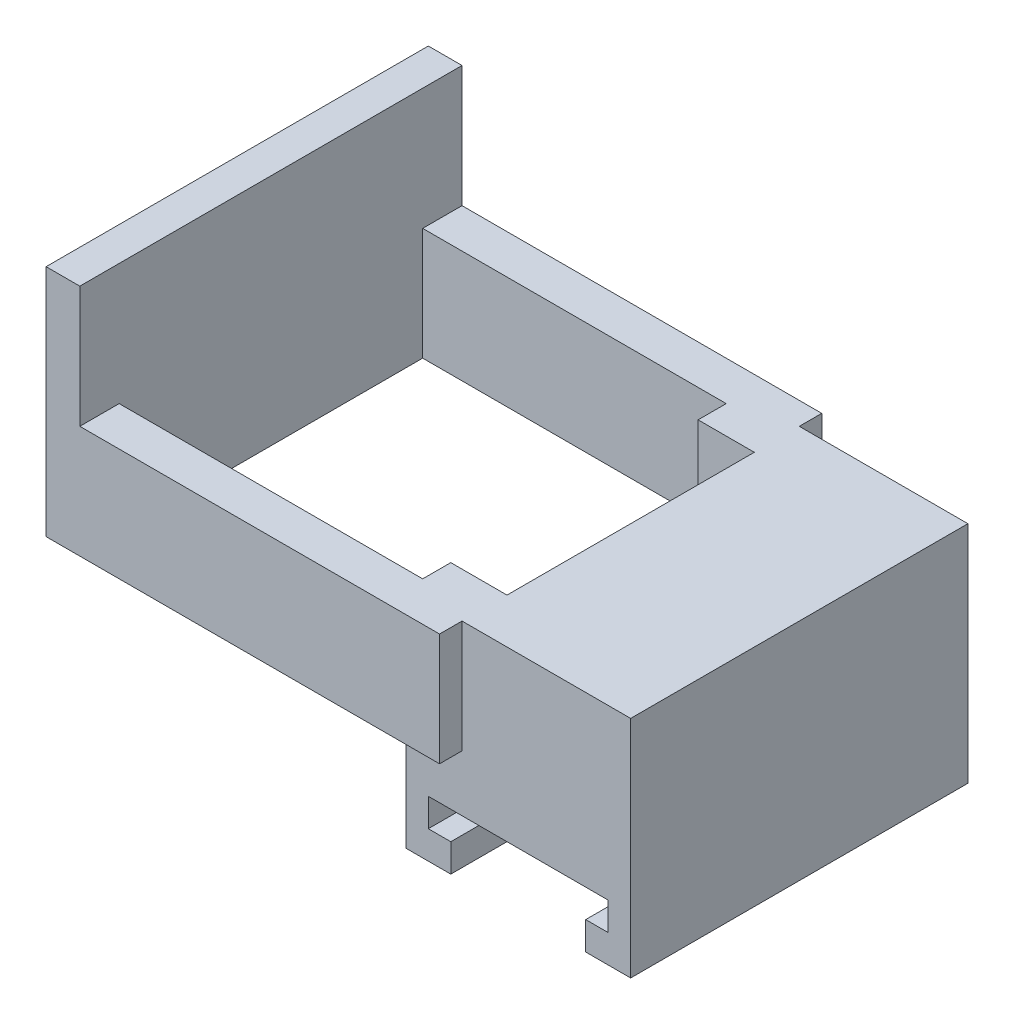
ISO-10303-21;
HEADER;
FILE_DESCRIPTION(('STEP AP214'),'2;1');
FILE_NAME('part.step','',(''),(''),'','','');
FILE_SCHEMA(('AUTOMOTIVE_DESIGN { 1 0 10303 214 1 1 1 1 }'));
ENDSEC;
DATA;
#1=APPLICATION_CONTEXT('core data for automotive mechanical design processes');
#2=APPLICATION_PROTOCOL_DEFINITION('international standard','automotive_design',2000,#1);
#3=PRODUCT_CONTEXT('',#1,'mechanical');
#4=PRODUCT('Part','Part','',(#3));
#5=PRODUCT_RELATED_PRODUCT_CATEGORY('part','',(#4));
#6=PRODUCT_DEFINITION_FORMATION('','',#4);
#7=PRODUCT_DEFINITION_CONTEXT('part definition',#1,'design');
#8=PRODUCT_DEFINITION('design','',#6,#7);
#9=PRODUCT_DEFINITION_SHAPE('','',#8);
#10=(LENGTH_UNIT() NAMED_UNIT(*) SI_UNIT(.MILLI.,.METRE.));
#11=(NAMED_UNIT(*) PLANE_ANGLE_UNIT() SI_UNIT($,.RADIAN.));
#12=(NAMED_UNIT(*) SI_UNIT($,.STERADIAN.) SOLID_ANGLE_UNIT());
#13=UNCERTAINTY_MEASURE_WITH_UNIT(LENGTH_MEASURE(1.E-05),#10,'distance_accuracy_value','');
#14=(GEOMETRIC_REPRESENTATION_CONTEXT(3) GLOBAL_UNCERTAINTY_ASSIGNED_CONTEXT((#13)) GLOBAL_UNIT_ASSIGNED_CONTEXT((#10,
#11,#12)) REPRESENTATION_CONTEXT('',''));
#15=CARTESIAN_POINT('',(0.,0.,0.));
#16=DIRECTION('',(0.,0.,1.));
#17=DIRECTION('',(1.,0.,0.));
#18=AXIS2_PLACEMENT_3D('',#15,#16,#17);
#19=CARTESIAN_POINT('',(0.,0.,0.));
#20=DIRECTION('',(0.,0.,-1.));
#21=DIRECTION('',(-1.,0.,0.));
#22=AXIS2_PLACEMENT_3D('',#19,#20,#21);
#23=PLANE('',#22);
#24=DIRECTION('',(0.,-1.,0.));
#25=VECTOR('',#24,1.);
#26=CARTESIAN_POINT('',(-19.7321469764376,-1.59822046465645,0.));
#27=LINE('',#26,#25);
#28=CARTESIAN_POINT('',(-19.7321469764376,18.4017795353435,0.));
#29=VERTEX_POINT('',#28);
#30=CARTESIAN_POINT('',(-19.7321469764376,-1.59822046465645,0.));
#31=VERTEX_POINT('',#30);
#32=EDGE_CURVE('E341',#29,#31,#27,.T.);
#33=ORIENTED_EDGE('',*,*,#32,.F.);
#34=DIRECTION('',(-1.,0.,0.));
#35=VECTOR('',#34,1.);
#36=CARTESIAN_POINT('',(-9.73214697643766,18.4017795353436,0.));
#37=LINE('',#36,#35);
#38=CARTESIAN_POINT('',(-9.73214697643766,18.4017795353436,0.));
#39=VERTEX_POINT('',#38);
#40=EDGE_CURVE('E285',#39,#29,#37,.T.);
#41=ORIENTED_EDGE('',*,*,#40,.F.);
#42=DIRECTION('',(0.,-1.,0.));
#43=VECTOR('',#42,1.);
#44=CARTESIAN_POINT('',(-9.73214697643766,38.4017795353436,0.));
#45=LINE('',#44,#43);
#46=CARTESIAN_POINT('',(-9.73214697643766,38.4017795353436,0.));
#47=VERTEX_POINT('',#46);
#48=EDGE_CURVE('E274',#47,#39,#45,.T.);
#49=ORIENTED_EDGE('',*,*,#48,.F.);
#50=DIRECTION('',(-1.,0.,0.));
#51=VECTOR('',#50,1.);
#52=CARTESIAN_POINT('',(-19.7321469764376,38.4017795353436,0.));
#53=LINE('',#52,#51);
#54=CARTESIAN_POINT('',(20.2678530235624,38.4017795353436,0.));
#55=VERTEX_POINT('',#54);
#56=EDGE_CURVE('E345',#55,#47,#53,.T.);
#57=ORIENTED_EDGE('',*,*,#56,.F.);
#58=DIRECTION('',(0.,1.,0.));
#59=VECTOR('',#58,1.);
#60=CARTESIAN_POINT('',(20.2678530235624,38.4017795353436,0.));
#61=LINE('',#60,#59);
#62=CARTESIAN_POINT('',(20.2678530235624,-1.59822046465645,0.));
#63=VERTEX_POINT('',#62);
#64=EDGE_CURVE('E387',#63,#55,#61,.T.);
#65=ORIENTED_EDGE('',*,*,#64,.F.);
#66=DIRECTION('',(1.,0.,0.));
#67=VECTOR('',#66,1.);
#68=CARTESIAN_POINT('',(20.2678530235624,-1.59822046465645,0.));
#69=LINE('',#68,#67);
#70=CARTESIAN_POINT('',(12.2678530235624,-1.59822046465645,0.));
#71=VERTEX_POINT('',#70);
#72=EDGE_CURVE('E385',#71,#63,#69,.T.);
#73=ORIENTED_EDGE('',*,*,#72,.F.);
#74=DIRECTION('',(0.,-1.,0.));
#75=VECTOR('',#74,1.);
#76=CARTESIAN_POINT('',(12.2678530235624,-1.59822046465645,0.));
#77=LINE('',#76,#75);
#78=CARTESIAN_POINT('',(12.2678530235624,3.40177953534355,0.));
#79=VERTEX_POINT('',#78);
#80=EDGE_CURVE('E383',#79,#71,#77,.T.);
#81=ORIENTED_EDGE('',*,*,#80,.F.);
#82=DIRECTION('',(-1.,0.,0.));
#83=VECTOR('',#82,1.);
#84=CARTESIAN_POINT('',(12.2678530235624,3.40177953534355,0.));
#85=LINE('',#84,#83);
#86=CARTESIAN_POINT('',(16.2678530235624,3.40177953534355,0.));
#87=VERTEX_POINT('',#86);
#88=EDGE_CURVE('E381',#87,#79,#85,.T.);
#89=ORIENTED_EDGE('',*,*,#88,.F.);
#90=DIRECTION('',(0.,-1.,0.));
#91=VECTOR('',#90,1.);
#92=CARTESIAN_POINT('',(16.2678530235624,3.40177953534355,0.));
#93=LINE('',#92,#91);
#94=CARTESIAN_POINT('',(16.2678530235624,8.40177953534355,0.));
#95=VERTEX_POINT('',#94);
#96=EDGE_CURVE('E379',#95,#87,#93,.T.);
#97=ORIENTED_EDGE('',*,*,#96,.F.);
#98=DIRECTION('',(1.,0.,0.));
#99=VECTOR('',#98,1.);
#100=CARTESIAN_POINT('',(-15.7321469764376,8.40177953534355,0.));
#101=LINE('',#100,#99);
#102=CARTESIAN_POINT('',(-15.7321469764376,8.40177953534355,0.));
#103=VERTEX_POINT('',#102);
#104=EDGE_CURVE('E377',#103,#95,#101,.T.);
#105=ORIENTED_EDGE('',*,*,#104,.F.);
#106=DIRECTION('',(0.,1.,0.));
#107=VECTOR('',#106,1.);
#108=CARTESIAN_POINT('',(-15.7321469764376,3.40177953534355,0.));
#109=LINE('',#108,#107);
#110=CARTESIAN_POINT('',(-15.7321469764376,3.40177953534355,0.));
#111=VERTEX_POINT('',#110);
#112=EDGE_CURVE('E375',#111,#103,#109,.T.);
#113=ORIENTED_EDGE('',*,*,#112,.F.);
#114=DIRECTION('',(-1.,0.,0.));
#115=VECTOR('',#114,1.);
#116=CARTESIAN_POINT('',(-11.7321469764376,3.40177953534355,0.));
#117=LINE('',#116,#115);
#118=CARTESIAN_POINT('',(-11.7321469764376,3.40177953534355,0.));
#119=VERTEX_POINT('',#118);
#120=EDGE_CURVE('E373',#119,#111,#117,.T.);
#121=ORIENTED_EDGE('',*,*,#120,.F.);
#122=DIRECTION('',(0.,1.,0.));
#123=VECTOR('',#122,1.);
#124=CARTESIAN_POINT('',(-11.7321469764376,-1.59822046465645,0.));
#125=LINE('',#124,#123);
#126=CARTESIAN_POINT('',(-11.7321469764376,-1.59822046465645,0.));
#127=VERTEX_POINT('',#126);
#128=EDGE_CURVE('E371',#127,#119,#125,.T.);
#129=ORIENTED_EDGE('',*,*,#128,.F.);
#130=DIRECTION('',(1.,0.,0.));
#131=VECTOR('',#130,1.);
#132=CARTESIAN_POINT('',(-19.7321469764376,-1.59822046465645,0.));
#133=LINE('',#132,#131);
#134=EDGE_CURVE('E369',#31,#127,#133,.T.);
#135=ORIENTED_EDGE('',*,*,#134,.F.);
#136=EDGE_LOOP('',(#33,#41,#49,#57,#65,#73,#81,#89,#97,#105,#113,#121,#129,#135));
#137=FACE_BOUND('',#136,.T.);
#138=ADVANCED_FACE('F35',(#137),#23,.T.);
#139=CARTESIAN_POINT('',(0.,0.,60.));
#140=DIRECTION('',(0.,0.,-1.));
#141=DIRECTION('',(-1.,0.,0.));
#142=AXIS2_PLACEMENT_3D('',#139,#140,#141);
#143=PLANE('',#142);
#144=DIRECTION('',(-1.,0.,0.));
#145=VECTOR('',#144,1.);
#146=CARTESIAN_POINT('',(-9.73214697643766,18.4017795353435,60.));
#147=LINE('',#146,#145);
#148=CARTESIAN_POINT('',(-9.73214697643766,18.4017795353435,60.));
#149=VERTEX_POINT('',#148);
#150=CARTESIAN_POINT('',(-19.7321469764376,18.4017795353435,60.));
#151=VERTEX_POINT('',#150);
#152=EDGE_CURVE('E297',#149,#151,#147,.T.);
#153=ORIENTED_EDGE('',*,*,#152,.T.);
#154=DIRECTION('',(0.,-1.,0.));
#155=VECTOR('',#154,1.);
#156=CARTESIAN_POINT('',(-19.7321469764376,-1.59822046465645,60.));
#157=LINE('',#156,#155);
#158=CARTESIAN_POINT('',(-19.7321469764376,-1.59822046465645,60.));
#159=VERTEX_POINT('',#158);
#160=EDGE_CURVE('E342',#151,#159,#157,.T.);
#161=ORIENTED_EDGE('',*,*,#160,.T.);
#162=DIRECTION('',(1.,0.,0.));
#163=VECTOR('',#162,1.);
#164=CARTESIAN_POINT('',(-19.7321469764376,-1.59822046465645,60.));
#165=LINE('',#164,#163);
#166=CARTESIAN_POINT('',(-11.7321469764376,-1.59822046465645,60.));
#167=VERTEX_POINT('',#166);
#168=EDGE_CURVE('E344',#159,#167,#165,.T.);
#169=ORIENTED_EDGE('',*,*,#168,.T.);
#170=DIRECTION('',(0.,1.,0.));
#171=VECTOR('',#170,1.);
#172=CARTESIAN_POINT('',(-11.7321469764376,-1.59822046465645,60.));
#173=LINE('',#172,#171);
#174=CARTESIAN_POINT('',(-11.7321469764376,3.40177953534355,60.));
#175=VERTEX_POINT('',#174);
#176=EDGE_CURVE('E347',#167,#175,#173,.T.);
#177=ORIENTED_EDGE('',*,*,#176,.T.);
#178=DIRECTION('',(-1.,0.,0.));
#179=VECTOR('',#178,1.);
#180=CARTESIAN_POINT('',(-11.7321469764376,3.40177953534355,60.));
#181=LINE('',#180,#179);
#182=CARTESIAN_POINT('',(-15.7321469764376,3.40177953534355,60.));
#183=VERTEX_POINT('',#182);
#184=EDGE_CURVE('E349',#175,#183,#181,.T.);
#185=ORIENTED_EDGE('',*,*,#184,.T.);
#186=DIRECTION('',(0.,1.,0.));
#187=VECTOR('',#186,1.);
#188=CARTESIAN_POINT('',(-15.7321469764376,3.40177953534355,60.));
#189=LINE('',#188,#187);
#190=CARTESIAN_POINT('',(-15.7321469764376,8.40177953534355,60.));
#191=VERTEX_POINT('',#190);
#192=EDGE_CURVE('E351',#183,#191,#189,.T.);
#193=ORIENTED_EDGE('',*,*,#192,.T.);
#194=DIRECTION('',(1.,0.,0.));
#195=VECTOR('',#194,1.);
#196=CARTESIAN_POINT('',(-15.7321469764376,8.40177953534355,60.));
#197=LINE('',#196,#195);
#198=CARTESIAN_POINT('',(16.2678530235624,8.40177953534355,60.));
#199=VERTEX_POINT('',#198);
#200=EDGE_CURVE('E353',#191,#199,#197,.T.);
#201=ORIENTED_EDGE('',*,*,#200,.T.);
#202=DIRECTION('',(0.,-1.,0.));
#203=VECTOR('',#202,1.);
#204=CARTESIAN_POINT('',(16.2678530235624,3.40177953534355,60.));
#205=LINE('',#204,#203);
#206=CARTESIAN_POINT('',(16.2678530235624,3.40177953534355,60.));
#207=VERTEX_POINT('',#206);
#208=EDGE_CURVE('E355',#199,#207,#205,.T.);
#209=ORIENTED_EDGE('',*,*,#208,.T.);
#210=DIRECTION('',(-1.,0.,0.));
#211=VECTOR('',#210,1.);
#212=CARTESIAN_POINT('',(12.2678530235624,3.40177953534355,60.));
#213=LINE('',#212,#211);
#214=CARTESIAN_POINT('',(12.2678530235624,3.40177953534355,60.));
#215=VERTEX_POINT('',#214);
#216=EDGE_CURVE('E357',#207,#215,#213,.T.);
#217=ORIENTED_EDGE('',*,*,#216,.T.);
#218=DIRECTION('',(0.,-1.,0.));
#219=VECTOR('',#218,1.);
#220=CARTESIAN_POINT('',(12.2678530235624,-1.59822046465645,60.));
#221=LINE('',#220,#219);
#222=CARTESIAN_POINT('',(12.2678530235624,-1.59822046465645,60.));
#223=VERTEX_POINT('',#222);
#224=EDGE_CURVE('E359',#215,#223,#221,.T.);
#225=ORIENTED_EDGE('',*,*,#224,.T.);
#226=DIRECTION('',(1.,0.,0.));
#227=VECTOR('',#226,1.);
#228=CARTESIAN_POINT('',(20.2678530235624,-1.59822046465645,60.));
#229=LINE('',#228,#227);
#230=CARTESIAN_POINT('',(20.2678530235624,-1.59822046465645,60.));
#231=VERTEX_POINT('',#230);
#232=EDGE_CURVE('E361',#223,#231,#229,.T.);
#233=ORIENTED_EDGE('',*,*,#232,.T.);
#234=DIRECTION('',(0.,1.,0.));
#235=VECTOR('',#234,1.);
#236=CARTESIAN_POINT('',(20.2678530235624,38.4017795353436,60.));
#237=LINE('',#236,#235);
#238=CARTESIAN_POINT('',(20.2678530235624,38.4017795353436,60.));
#239=VERTEX_POINT('',#238);
#240=EDGE_CURVE('E363',#231,#239,#237,.T.);
#241=ORIENTED_EDGE('',*,*,#240,.T.);
#242=DIRECTION('',(-1.,0.,0.));
#243=VECTOR('',#242,1.);
#244=CARTESIAN_POINT('',(-19.7321469764376,38.4017795353436,60.));
#245=LINE('',#244,#243);
#246=CARTESIAN_POINT('',(-9.73214697643766,38.4017795353436,60.));
#247=VERTEX_POINT('',#246);
#248=EDGE_CURVE('E365',#239,#247,#245,.T.);
#249=ORIENTED_EDGE('',*,*,#248,.T.);
#250=DIRECTION('',(0.,1.,0.));
#251=VECTOR('',#250,1.);
#252=CARTESIAN_POINT('',(-9.73214697643766,38.4017795353436,60.));
#253=LINE('',#252,#251);
#254=EDGE_CURVE('E292',#149,#247,#253,.T.);
#255=ORIENTED_EDGE('',*,*,#254,.F.);
#256=EDGE_LOOP('',(#153,#161,#169,#177,#185,#193,#201,#209,#217,#225,#233,#241,#249,#255));
#257=FACE_BOUND('',#256,.T.);
#258=ADVANCED_FACE('F461',(#257),#143,.F.);
#259=CARTESIAN_POINT('',(-19.7321469764376,-1.59822046465645,60.));
#260=DIRECTION('',(1.,0.,0.));
#261=DIRECTION('',(0.,0.,-1.));
#262=AXIS2_PLACEMENT_3D('',#259,#260,#261);
#263=PLANE('',#262);
#264=DIRECTION('',(0.,0.,1.));
#265=VECTOR('',#264,1.);
#266=CARTESIAN_POINT('',(-19.7321469764376,13.4017795353436,8.));
#267=LINE('',#266,#265);
#268=CARTESIAN_POINT('',(-19.7321469764376,13.4017795353436,8.));
#269=VERTEX_POINT('',#268);
#270=CARTESIAN_POINT('',(-19.7321469764376,13.4017795353436,52.));
#271=VERTEX_POINT('',#270);
#272=EDGE_CURVE('E244',#269,#271,#267,.T.);
#273=ORIENTED_EDGE('',*,*,#272,.F.);
#274=DIRECTION('',(0.,-1.,0.));
#275=VECTOR('',#274,1.);
#276=CARTESIAN_POINT('',(-19.7321469764376,13.4017795353436,8.));
#277=LINE('',#276,#275);
#278=CARTESIAN_POINT('',(-19.7321469764376,38.4017795353436,8.));
#279=VERTEX_POINT('',#278);
#280=EDGE_CURVE('E233',#279,#269,#277,.T.);
#281=ORIENTED_EDGE('',*,*,#280,.F.);
#282=DIRECTION('',(0.,0.,-1.));
#283=VECTOR('',#282,1.);
#284=CARTESIAN_POINT('',(-19.7321469764376,38.4017795353436,60.));
#285=LINE('',#284,#283);
#286=CARTESIAN_POINT('',(-19.7321469764376,38.4017795353436,3.));
#287=VERTEX_POINT('',#286);
#288=EDGE_CURVE('E58',#279,#287,#285,.T.);
#289=ORIENTED_EDGE('',*,*,#288,.T.);
#290=DIRECTION('',(0.,1.,0.));
#291=VECTOR('',#290,1.);
#292=CARTESIAN_POINT('',(-19.7321469764376,38.4017795353436,3.));
#293=LINE('',#292,#291);
#294=CARTESIAN_POINT('',(-19.7321469764376,18.4017795353436,3.));
#295=VERTEX_POINT('',#294);
#296=EDGE_CURVE('E319',#295,#287,#293,.T.);
#297=ORIENTED_EDGE('',*,*,#296,.F.);
#298=DIRECTION('',(0.,0.,1.));
#299=VECTOR('',#298,1.);
#300=CARTESIAN_POINT('',(-19.7321469764376,18.4017795353436,-4.));
#301=LINE('',#300,#299);
#302=EDGE_CURVE('E327',#29,#295,#301,.T.);
#303=ORIENTED_EDGE('',*,*,#302,.F.);
#304=ORIENTED_EDGE('',*,*,#32,.T.);
#305=DIRECTION('',(0.,0.,-1.));
#306=VECTOR('',#305,1.);
#307=CARTESIAN_POINT('',(-19.7321469764376,-1.59822046465645,60.));
#308=LINE('',#307,#306);
#309=EDGE_CURVE('E330',#159,#31,#308,.T.);
#310=ORIENTED_EDGE('',*,*,#309,.F.);
#311=ORIENTED_EDGE('',*,*,#160,.F.);
#312=DIRECTION('',(0.,0.,1.));
#313=VECTOR('',#312,1.);
#314=CARTESIAN_POINT('',(-19.7321469764376,18.4017795353436,64.));
#315=LINE('',#314,#313);
#316=CARTESIAN_POINT('',(-19.7321469764376,18.4017795353435,57.));
#317=VERTEX_POINT('',#316);
#318=EDGE_CURVE('E304',#317,#151,#315,.T.);
#319=ORIENTED_EDGE('',*,*,#318,.F.);
#320=DIRECTION('',(0.,-1.,0.));
#321=VECTOR('',#320,1.);
#322=CARTESIAN_POINT('',(-19.7321469764376,38.4017795353436,57.));
#323=LINE('',#322,#321);
#324=CARTESIAN_POINT('',(-19.7321469764376,38.4017795353436,57.));
#325=VERTEX_POINT('',#324);
#326=EDGE_CURVE('E299',#325,#317,#323,.T.);
#327=ORIENTED_EDGE('',*,*,#326,.F.);
#328=CARTESIAN_POINT('',(-19.7321469764376,38.4017795353436,52.));
#329=VERTEX_POINT('',#328);
#330=EDGE_CURVE('E391',#325,#329,#285,.T.);
#331=ORIENTED_EDGE('',*,*,#330,.T.);
#332=DIRECTION('',(0.,1.,0.));
#333=VECTOR('',#332,1.);
#334=CARTESIAN_POINT('',(-19.7321469764376,13.4017795353436,52.));
#335=LINE('',#334,#333);
#336=EDGE_CURVE('E228',#271,#329,#335,.T.);
#337=ORIENTED_EDGE('',*,*,#336,.F.);
#338=EDGE_LOOP('',(#273,#281,#289,#297,#303,#304,#310,#311,#319,#327,#331,#337));
#339=FACE_BOUND('',#338,.T.);
#340=ADVANCED_FACE('F37',(#339),#263,.F.);
#341=CARTESIAN_POINT('',(-19.7321469764376,-1.59822046465645,60.));
#342=DIRECTION('',(0.,1.,0.));
#343=DIRECTION('',(0.,0.,1.));
#344=AXIS2_PLACEMENT_3D('',#341,#342,#343);
#345=PLANE('',#344);
#346=ORIENTED_EDGE('',*,*,#134,.T.);
#347=DIRECTION('',(0.,0.,-1.));
#348=VECTOR('',#347,1.);
#349=CARTESIAN_POINT('',(-11.7321469764376,-1.59822046465645,60.));
#350=LINE('',#349,#348);
#351=EDGE_CURVE('E421',#167,#127,#350,.T.);
#352=ORIENTED_EDGE('',*,*,#351,.F.);
#353=ORIENTED_EDGE('',*,*,#168,.F.);
#354=ORIENTED_EDGE('',*,*,#309,.T.);
#355=EDGE_LOOP('',(#346,#352,#353,#354));
#356=FACE_BOUND('',#355,.T.);
#357=ADVANCED_FACE('F495',(#356),#345,.F.);
#358=CARTESIAN_POINT('',(-11.7321469764376,-1.59822046465645,60.));
#359=DIRECTION('',(-1.,0.,0.));
#360=DIRECTION('',(0.,0.,1.));
#361=AXIS2_PLACEMENT_3D('',#358,#359,#360);
#362=PLANE('',#361);
#363=ORIENTED_EDGE('',*,*,#128,.T.);
#364=DIRECTION('',(0.,0.,-1.));
#365=VECTOR('',#364,1.);
#366=CARTESIAN_POINT('',(-11.7321469764376,3.40177953534355,60.));
#367=LINE('',#366,#365);
#368=EDGE_CURVE('E418',#175,#119,#367,.T.);
#369=ORIENTED_EDGE('',*,*,#368,.F.);
#370=ORIENTED_EDGE('',*,*,#176,.F.);
#371=ORIENTED_EDGE('',*,*,#351,.T.);
#372=EDGE_LOOP('',(#363,#369,#370,#371));
#373=FACE_BOUND('',#372,.T.);
#374=ADVANCED_FACE('F499',(#373),#362,.F.);
#375=CARTESIAN_POINT('',(-11.7321469764376,3.40177953534355,60.));
#376=DIRECTION('',(0.,-1.,0.));
#377=DIRECTION('',(0.,0.,-1.));
#378=AXIS2_PLACEMENT_3D('',#375,#376,#377);
#379=PLANE('',#378);
#380=ORIENTED_EDGE('',*,*,#120,.T.);
#381=DIRECTION('',(0.,0.,-1.));
#382=VECTOR('',#381,1.);
#383=CARTESIAN_POINT('',(-15.7321469764376,3.40177953534355,60.));
#384=LINE('',#383,#382);
#385=EDGE_CURVE('E415',#183,#111,#384,.T.);
#386=ORIENTED_EDGE('',*,*,#385,.F.);
#387=ORIENTED_EDGE('',*,*,#184,.F.);
#388=ORIENTED_EDGE('',*,*,#368,.T.);
#389=EDGE_LOOP('',(#380,#386,#387,#388));
#390=FACE_BOUND('',#389,.T.);
#391=ADVANCED_FACE('F503',(#390),#379,.F.);
#392=CARTESIAN_POINT('',(-15.7321469764376,3.40177953534355,60.));
#393=DIRECTION('',(-1.,0.,0.));
#394=DIRECTION('',(0.,0.,1.));
#395=AXIS2_PLACEMENT_3D('',#392,#393,#394);
#396=PLANE('',#395);
#397=ORIENTED_EDGE('',*,*,#112,.T.);
#398=DIRECTION('',(0.,0.,-1.));
#399=VECTOR('',#398,1.);
#400=CARTESIAN_POINT('',(-15.7321469764376,8.40177953534355,60.));
#401=LINE('',#400,#399);
#402=EDGE_CURVE('E412',#191,#103,#401,.T.);
#403=ORIENTED_EDGE('',*,*,#402,.F.);
#404=ORIENTED_EDGE('',*,*,#192,.F.);
#405=ORIENTED_EDGE('',*,*,#385,.T.);
#406=EDGE_LOOP('',(#397,#403,#404,#405));
#407=FACE_BOUND('',#406,.T.);
#408=ADVANCED_FACE('F509',(#407),#396,.F.);
#409=CARTESIAN_POINT('',(-15.7321469764376,8.40177953534355,60.));
#410=DIRECTION('',(0.,1.,0.));
#411=DIRECTION('',(0.,0.,1.));
#412=AXIS2_PLACEMENT_3D('',#409,#410,#411);
#413=PLANE('',#412);
#414=ORIENTED_EDGE('',*,*,#104,.T.);
#415=DIRECTION('',(0.,0.,-1.));
#416=VECTOR('',#415,1.);
#417=CARTESIAN_POINT('',(16.2678530235624,8.40177953534355,60.));
#418=LINE('',#417,#416);
#419=EDGE_CURVE('E409',#199,#95,#418,.T.);
#420=ORIENTED_EDGE('',*,*,#419,.F.);
#421=ORIENTED_EDGE('',*,*,#200,.F.);
#422=ORIENTED_EDGE('',*,*,#402,.T.);
#423=EDGE_LOOP('',(#414,#420,#421,#422));
#424=FACE_BOUND('',#423,.T.);
#425=ADVANCED_FACE('F513',(#424),#413,.F.);
#426=CARTESIAN_POINT('',(16.2678530235624,3.40177953534355,60.));
#427=DIRECTION('',(1.,0.,0.));
#428=DIRECTION('',(0.,0.,-1.));
#429=AXIS2_PLACEMENT_3D('',#426,#427,#428);
#430=PLANE('',#429);
#431=ORIENTED_EDGE('',*,*,#96,.T.);
#432=DIRECTION('',(0.,0.,-1.));
#433=VECTOR('',#432,1.);
#434=CARTESIAN_POINT('',(16.2678530235624,3.40177953534355,60.));
#435=LINE('',#434,#433);
#436=EDGE_CURVE('E406',#207,#87,#435,.T.);
#437=ORIENTED_EDGE('',*,*,#436,.F.);
#438=ORIENTED_EDGE('',*,*,#208,.F.);
#439=ORIENTED_EDGE('',*,*,#419,.T.);
#440=EDGE_LOOP('',(#431,#437,#438,#439));
#441=FACE_BOUND('',#440,.T.);
#442=ADVANCED_FACE('F518',(#441),#430,.F.);
#443=CARTESIAN_POINT('',(12.2678530235624,3.40177953534355,60.));
#444=DIRECTION('',(0.,-1.,0.));
#445=DIRECTION('',(0.,0.,-1.));
#446=AXIS2_PLACEMENT_3D('',#443,#444,#445);
#447=PLANE('',#446);
#448=ORIENTED_EDGE('',*,*,#88,.T.);
#449=DIRECTION('',(0.,0.,-1.));
#450=VECTOR('',#449,1.);
#451=CARTESIAN_POINT('',(12.2678530235624,3.40177953534355,60.));
#452=LINE('',#451,#450);
#453=EDGE_CURVE('E403',#215,#79,#452,.T.);
#454=ORIENTED_EDGE('',*,*,#453,.F.);
#455=ORIENTED_EDGE('',*,*,#216,.F.);
#456=ORIENTED_EDGE('',*,*,#436,.T.);
#457=EDGE_LOOP('',(#448,#454,#455,#456));
#458=FACE_BOUND('',#457,.T.);
#459=ADVANCED_FACE('F524',(#458),#447,.F.);
#460=CARTESIAN_POINT('',(12.2678530235624,-1.59822046465645,60.));
#461=DIRECTION('',(1.,0.,0.));
#462=DIRECTION('',(0.,0.,-1.));
#463=AXIS2_PLACEMENT_3D('',#460,#461,#462);
#464=PLANE('',#463);
#465=ORIENTED_EDGE('',*,*,#80,.T.);
#466=DIRECTION('',(0.,0.,-1.));
#467=VECTOR('',#466,1.);
#468=CARTESIAN_POINT('',(12.2678530235624,-1.59822046465645,60.));
#469=LINE('',#468,#467);
#470=EDGE_CURVE('E400',#223,#71,#469,.T.);
#471=ORIENTED_EDGE('',*,*,#470,.F.);
#472=ORIENTED_EDGE('',*,*,#224,.F.);
#473=ORIENTED_EDGE('',*,*,#453,.T.);
#474=EDGE_LOOP('',(#465,#471,#472,#473));
#475=FACE_BOUND('',#474,.T.);
#476=ADVANCED_FACE('F528',(#475),#464,.F.);
#477=CARTESIAN_POINT('',(20.2678530235624,-1.59822046465645,60.));
#478=DIRECTION('',(0.,1.,0.));
#479=DIRECTION('',(0.,0.,1.));
#480=AXIS2_PLACEMENT_3D('',#477,#478,#479);
#481=PLANE('',#480);
#482=ORIENTED_EDGE('',*,*,#72,.T.);
#483=DIRECTION('',(0.,0.,-1.));
#484=VECTOR('',#483,1.);
#485=CARTESIAN_POINT('',(20.2678530235624,-1.59822046465645,60.));
#486=LINE('',#485,#484);
#487=EDGE_CURVE('E397',#231,#63,#486,.T.);
#488=ORIENTED_EDGE('',*,*,#487,.F.);
#489=ORIENTED_EDGE('',*,*,#232,.F.);
#490=ORIENTED_EDGE('',*,*,#470,.T.);
#491=EDGE_LOOP('',(#482,#488,#489,#490));
#492=FACE_BOUND('',#491,.T.);
#493=ADVANCED_FACE('F532',(#492),#481,.F.);
#494=CARTESIAN_POINT('',(20.2678530235624,38.4017795353436,60.));
#495=DIRECTION('',(-1.,0.,0.));
#496=DIRECTION('',(0.,-1.,0.));
#497=AXIS2_PLACEMENT_3D('',#494,#495,#496);
#498=PLANE('',#497);
#499=ORIENTED_EDGE('',*,*,#64,.T.);
#500=DIRECTION('',(0.,0.,-1.));
#501=VECTOR('',#500,1.);
#502=CARTESIAN_POINT('',(20.2678530235624,38.4017795353436,60.));
#503=LINE('',#502,#501);
#504=EDGE_CURVE('E394',#239,#55,#503,.T.);
#505=ORIENTED_EDGE('',*,*,#504,.F.);
#506=ORIENTED_EDGE('',*,*,#240,.F.);
#507=ORIENTED_EDGE('',*,*,#487,.T.);
#508=EDGE_LOOP('',(#499,#505,#506,#507));
#509=FACE_BOUND('',#508,.T.);
#510=ADVANCED_FACE('F533',(#509),#498,.F.);
#511=CARTESIAN_POINT('',(-19.7321469764376,38.4017795353436,60.));
#512=DIRECTION('',(0.,-1.,0.));
#513=DIRECTION('',(1.,0.,0.));
#514=AXIS2_PLACEMENT_3D('',#511,#512,#513);
#515=PLANE('',#514);
#516=ORIENTED_EDGE('',*,*,#288,.F.);
#517=DIRECTION('',(1.,0.,0.));
#518=VECTOR('',#517,1.);
#519=CARTESIAN_POINT('',(-19.7321469764376,38.4017795353436,8.));
#520=LINE('',#519,#518);
#521=CARTESIAN_POINT('',(-9.73214697643765,38.4017795353436,8.));
#522=VERTEX_POINT('',#521);
#523=EDGE_CURVE('E11',#279,#522,#520,.T.);
#524=ORIENTED_EDGE('',*,*,#523,.T.);
#525=DIRECTION('',(0.,0.,1.));
#526=VECTOR('',#525,1.);
#527=CARTESIAN_POINT('',(-9.73214697643765,38.4017795353436,60.));
#528=LINE('',#527,#526);
#529=CARTESIAN_POINT('',(-9.73214697643765,38.4017795353436,52.));
#530=VERTEX_POINT('',#529);
#531=EDGE_CURVE('E226',#522,#530,#528,.T.);
#532=ORIENTED_EDGE('',*,*,#531,.T.);
#533=DIRECTION('',(-1.,0.,0.));
#534=VECTOR('',#533,1.);
#535=CARTESIAN_POINT('',(-19.7321469764376,38.4017795353436,52.));
#536=LINE('',#535,#534);
#537=EDGE_CURVE('E43',#530,#329,#536,.T.);
#538=ORIENTED_EDGE('',*,*,#537,.T.);
#539=ORIENTED_EDGE('',*,*,#330,.F.);
#540=DIRECTION('',(1.,0.,0.));
#541=VECTOR('',#540,1.);
#542=CARTESIAN_POINT('',(-73.7321469764377,38.4017795353436,57.));
#543=LINE('',#542,#541);
#544=CARTESIAN_POINT('',(-73.7321469764377,38.4017795353436,57.));
#545=VERTEX_POINT('',#544);
#546=EDGE_CURVE('E315',#545,#325,#543,.T.);
#547=ORIENTED_EDGE('',*,*,#546,.F.);
#548=DIRECTION('',(0.,0.,-1.));
#549=VECTOR('',#548,1.);
#550=CARTESIAN_POINT('',(-73.7321469764377,38.4017795353436,64.));
#551=LINE('',#550,#549);
#552=CARTESIAN_POINT('',(-73.7321469764377,38.4017795353435,64.));
#553=VERTEX_POINT('',#552);
#554=EDGE_CURVE('E300',#553,#545,#551,.T.);
#555=ORIENTED_EDGE('',*,*,#554,.F.);
#556=DIRECTION('',(1.,0.,0.));
#557=VECTOR('',#556,1.);
#558=CARTESIAN_POINT('',(-73.7321469764377,38.4017795353436,64.));
#559=LINE('',#558,#557);
#560=CARTESIAN_POINT('',(-9.73214697643766,38.4017795353436,64.));
#561=VERTEX_POINT('',#560);
#562=EDGE_CURVE('E317',#553,#561,#559,.T.);
#563=ORIENTED_EDGE('',*,*,#562,.T.);
#564=DIRECTION('',(0.,0.,1.));
#565=VECTOR('',#564,1.);
#566=CARTESIAN_POINT('',(-9.73214697643766,38.4017795353436,64.));
#567=LINE('',#566,#565);
#568=EDGE_CURVE('E294',#247,#561,#567,.T.);
#569=ORIENTED_EDGE('',*,*,#568,.F.);
#570=ORIENTED_EDGE('',*,*,#248,.F.);
#571=ORIENTED_EDGE('',*,*,#504,.T.);
#572=ORIENTED_EDGE('',*,*,#56,.T.);
#573=DIRECTION('',(0.,0.,1.));
#574=VECTOR('',#573,1.);
#575=CARTESIAN_POINT('',(-9.73214697643766,38.4017795353436,0.));
#576=LINE('',#575,#574);
#577=CARTESIAN_POINT('',(-9.73214697643766,38.4017795353436,-4.));
#578=VERTEX_POINT('',#577);
#579=EDGE_CURVE('E283',#578,#47,#576,.T.);
#580=ORIENTED_EDGE('',*,*,#579,.F.);
#581=DIRECTION('',(1.,0.,0.));
#582=VECTOR('',#581,1.);
#583=CARTESIAN_POINT('',(-73.7321469764377,38.4017795353436,-4.));
#584=LINE('',#583,#582);
#585=CARTESIAN_POINT('',(-73.7321469764377,38.4017795353436,-4.));
#586=VERTEX_POINT('',#585);
#587=EDGE_CURVE('E326',#586,#578,#584,.T.);
#588=ORIENTED_EDGE('',*,*,#587,.F.);
#589=DIRECTION('',(0.,0.,-1.));
#590=VECTOR('',#589,1.);
#591=CARTESIAN_POINT('',(-73.7321469764377,38.4017795353436,-4.));
#592=LINE('',#591,#590);
#593=CARTESIAN_POINT('',(-73.7321469764377,38.4017795353436,3.));
#594=VERTEX_POINT('',#593);
#595=EDGE_CURVE('E323',#594,#586,#592,.T.);
#596=ORIENTED_EDGE('',*,*,#595,.F.);
#597=DIRECTION('',(1.,0.,0.));
#598=VECTOR('',#597,1.);
#599=CARTESIAN_POINT('',(-73.7321469764377,38.4017795353436,3.));
#600=LINE('',#599,#598);
#601=EDGE_CURVE('E333',#594,#287,#600,.T.);
#602=ORIENTED_EDGE('',*,*,#601,.T.);
#603=EDGE_LOOP('',(#516,#524,#532,#538,#539,#547,#555,#563,#569,#570,#571,#572,#580,#588,#596,#602));
#604=FACE_BOUND('',#603,.T.);
#605=ADVANCED_FACE('F429',(#604),#515,.F.);
#606=CARTESIAN_POINT('',(-73.7321469764377,38.4017795353436,-4.));
#607=DIRECTION('',(0.,0.,1.));
#608=DIRECTION('',(0.,-1.,0.));
#609=AXIS2_PLACEMENT_3D('',#606,#607,#608);
#610=PLANE('',#609);
#611=ORIENTED_EDGE('',*,*,#587,.T.);
#612=DIRECTION('',(0.,1.,0.));
#613=VECTOR('',#612,1.);
#614=CARTESIAN_POINT('',(-9.73214697643766,38.4017795353436,-4.));
#615=LINE('',#614,#613);
#616=CARTESIAN_POINT('',(-9.73214697643766,18.4017795353436,-4.));
#617=VERTEX_POINT('',#616);
#618=EDGE_CURVE('E280',#617,#578,#615,.T.);
#619=ORIENTED_EDGE('',*,*,#618,.F.);
#620=DIRECTION('',(1.,0.,0.));
#621=VECTOR('',#620,1.);
#622=CARTESIAN_POINT('',(-73.7321469764377,18.4017795353436,-4.));
#623=LINE('',#622,#621);
#624=CARTESIAN_POINT('',(-79.7321469764377,18.4017795353436,-4.));
#625=VERTEX_POINT('',#624);
#626=EDGE_CURVE('E339',#625,#617,#623,.T.);
#627=ORIENTED_EDGE('',*,*,#626,.F.);
#628=DIRECTION('',(0.,-1.,0.));
#629=VECTOR('',#628,1.);
#630=CARTESIAN_POINT('',(-79.7321469764377,18.4017795353436,-4.));
#631=LINE('',#630,#629);
#632=CARTESIAN_POINT('',(-79.7321469764377,60.,-4.));
#633=VERTEX_POINT('',#632);
#634=EDGE_CURVE('E249',#633,#625,#631,.T.);
#635=ORIENTED_EDGE('',*,*,#634,.F.);
#636=DIRECTION('',(1.,0.,0.));
#637=VECTOR('',#636,1.);
#638=CARTESIAN_POINT('',(-79.7321469764377,60.,-4.));
#639=LINE('',#638,#637);
#640=CARTESIAN_POINT('',(-73.7321469764377,60.,-4.));
#641=VERTEX_POINT('',#640);
#642=EDGE_CURVE('E260',#633,#641,#639,.T.);
#643=ORIENTED_EDGE('',*,*,#642,.T.);
#644=DIRECTION('',(0.,-1.,0.));
#645=VECTOR('',#644,1.);
#646=CARTESIAN_POINT('',(-73.7321469764377,18.4017795353436,-4.));
#647=LINE('',#646,#645);
#648=EDGE_CURVE('E247',#641,#586,#647,.T.);
#649=ORIENTED_EDGE('',*,*,#648,.T.);
#650=EDGE_LOOP('',(#611,#619,#627,#635,#643,#649));
#651=FACE_BOUND('',#650,.T.);
#652=ADVANCED_FACE('F479',(#651),#610,.F.);
#653=CARTESIAN_POINT('',(-73.7321469764377,18.4017795353436,-4.));
#654=DIRECTION('',(0.,1.,0.));
#655=DIRECTION('',(0.,0.,1.));
#656=AXIS2_PLACEMENT_3D('',#653,#654,#655);
#657=PLANE('',#656);
#658=ORIENTED_EDGE('',*,*,#626,.T.);
#659=DIRECTION('',(0.,0.,-1.));
#660=VECTOR('',#659,1.);
#661=CARTESIAN_POINT('',(-9.73214697643766,18.4017795353436,0.));
#662=LINE('',#661,#660);
#663=EDGE_CURVE('E277',#39,#617,#662,.T.);
#664=ORIENTED_EDGE('',*,*,#663,.F.);
#665=ORIENTED_EDGE('',*,*,#40,.T.);
#666=ORIENTED_EDGE('',*,*,#302,.T.);
#667=DIRECTION('',(1.,0.,0.));
#668=VECTOR('',#667,1.);
#669=CARTESIAN_POINT('',(-73.7321469764377,18.4017795353436,3.));
#670=LINE('',#669,#668);
#671=CARTESIAN_POINT('',(-73.7321469764377,18.4017795353436,3.));
#672=VERTEX_POINT('',#671);
#673=EDGE_CURVE('E336',#672,#295,#670,.T.);
#674=ORIENTED_EDGE('',*,*,#673,.F.);
#675=DIRECTION('',(0.,0.,1.));
#676=VECTOR('',#675,1.);
#677=CARTESIAN_POINT('',(-73.7321469764377,18.4017795353436,-4.));
#678=LINE('',#677,#676);
#679=CARTESIAN_POINT('',(-73.7321469764377,18.4017795353435,57.));
#680=VERTEX_POINT('',#679);
#681=EDGE_CURVE('E263',#672,#680,#678,.T.);
#682=ORIENTED_EDGE('',*,*,#681,.T.);
#683=DIRECTION('',(1.,0.,0.));
#684=VECTOR('',#683,1.);
#685=CARTESIAN_POINT('',(-73.7321469764377,18.4017795353435,57.));
#686=LINE('',#685,#684);
#687=EDGE_CURVE('E312',#680,#317,#686,.T.);
#688=ORIENTED_EDGE('',*,*,#687,.T.);
#689=ORIENTED_EDGE('',*,*,#318,.T.);
#690=ORIENTED_EDGE('',*,*,#152,.F.);
#691=DIRECTION('',(0.,0.,-1.));
#692=VECTOR('',#691,1.);
#693=CARTESIAN_POINT('',(-9.73214697643766,18.4017795353435,64.));
#694=LINE('',#693,#692);
#695=CARTESIAN_POINT('',(-9.73214697643766,18.4017795353435,64.));
#696=VERTEX_POINT('',#695);
#697=EDGE_CURVE('E290',#696,#149,#694,.T.);
#698=ORIENTED_EDGE('',*,*,#697,.F.);
#699=DIRECTION('',(1.,0.,0.));
#700=VECTOR('',#699,1.);
#701=CARTESIAN_POINT('',(-73.7321469764377,18.4017795353436,64.));
#702=LINE('',#701,#700);
#703=CARTESIAN_POINT('',(-79.7321469764377,18.4017795353436,64.));
#704=VERTEX_POINT('',#703);
#705=EDGE_CURVE('E307',#704,#696,#702,.T.);
#706=ORIENTED_EDGE('',*,*,#705,.F.);
#707=DIRECTION('',(0.,0.,1.));
#708=VECTOR('',#707,1.);
#709=CARTESIAN_POINT('',(-79.7321469764377,18.4017795353436,-4.));
#710=LINE('',#709,#708);
#711=EDGE_CURVE('E252',#625,#704,#710,.T.);
#712=ORIENTED_EDGE('',*,*,#711,.F.);
#713=EDGE_LOOP('',(#658,#664,#665,#666,#674,#682,#688,#689,#690,#698,#706,#712));
#714=FACE_BOUND('',#713,.T.);
#715=ADVANCED_FACE('F439',(#714),#657,.F.);
#716=CARTESIAN_POINT('',(-73.7321469764377,38.4017795353436,3.));
#717=DIRECTION('',(0.,0.,-1.));
#718=DIRECTION('',(0.,1.,0.));
#719=AXIS2_PLACEMENT_3D('',#716,#717,#718);
#720=PLANE('',#719);
#721=ORIENTED_EDGE('',*,*,#296,.T.);
#722=ORIENTED_EDGE('',*,*,#601,.F.);
#723=DIRECTION('',(0.,1.,0.));
#724=VECTOR('',#723,1.);
#725=CARTESIAN_POINT('',(-73.7321469764377,38.4017795353436,3.));
#726=LINE('',#725,#724);
#727=EDGE_CURVE('E320',#672,#594,#726,.T.);
#728=ORIENTED_EDGE('',*,*,#727,.F.);
#729=ORIENTED_EDGE('',*,*,#673,.T.);
#730=EDGE_LOOP('',(#721,#722,#728,#729));
#731=FACE_BOUND('',#730,.T.);
#732=ADVANCED_FACE('F553',(#731),#720,.F.);
#733=CARTESIAN_POINT('',(-73.7321469764377,38.4017795353436,64.));
#734=DIRECTION('',(0.,0.,-1.));
#735=DIRECTION('',(-1.,0.,0.));
#736=AXIS2_PLACEMENT_3D('',#733,#734,#735);
#737=PLANE('',#736);
#738=ORIENTED_EDGE('',*,*,#705,.T.);
#739=DIRECTION('',(0.,-1.,0.));
#740=VECTOR('',#739,1.);
#741=CARTESIAN_POINT('',(-9.73214697643766,38.4017795353436,64.));
#742=LINE('',#741,#740);
#743=EDGE_CURVE('E287',#561,#696,#742,.T.);
#744=ORIENTED_EDGE('',*,*,#743,.F.);
#745=ORIENTED_EDGE('',*,*,#562,.F.);
#746=DIRECTION('',(0.,1.,0.));
#747=VECTOR('',#746,1.);
#748=CARTESIAN_POINT('',(-73.7321469764377,18.4017795353436,64.));
#749=LINE('',#748,#747);
#750=CARTESIAN_POINT('',(-73.7321469764377,60.,64.));
#751=VERTEX_POINT('',#750);
#752=EDGE_CURVE('E266',#553,#751,#749,.T.);
#753=ORIENTED_EDGE('',*,*,#752,.T.);
#754=DIRECTION('',(1.,0.,0.));
#755=VECTOR('',#754,1.);
#756=CARTESIAN_POINT('',(-79.7321469764377,60.,64.));
#757=LINE('',#756,#755);
#758=CARTESIAN_POINT('',(-79.7321469764377,60.,64.));
#759=VERTEX_POINT('',#758);
#760=EDGE_CURVE('E271',#759,#751,#757,.T.);
#761=ORIENTED_EDGE('',*,*,#760,.F.);
#762=DIRECTION('',(0.,1.,0.));
#763=VECTOR('',#762,1.);
#764=CARTESIAN_POINT('',(-79.7321469764377,18.4017795353436,64.));
#765=LINE('',#764,#763);
#766=EDGE_CURVE('E256',#704,#759,#765,.T.);
#767=ORIENTED_EDGE('',*,*,#766,.F.);
#768=EDGE_LOOP('',(#738,#744,#745,#753,#761,#767));
#769=FACE_BOUND('',#768,.T.);
#770=ADVANCED_FACE('F455',(#769),#737,.F.);
#771=CARTESIAN_POINT('',(-73.7321469764377,38.4017795353436,57.));
#772=DIRECTION('',(0.,0.,1.));
#773=DIRECTION('',(0.,-1.,0.));
#774=AXIS2_PLACEMENT_3D('',#771,#772,#773);
#775=PLANE('',#774);
#776=ORIENTED_EDGE('',*,*,#326,.T.);
#777=ORIENTED_EDGE('',*,*,#687,.F.);
#778=DIRECTION('',(0.,-1.,0.));
#779=VECTOR('',#778,1.);
#780=CARTESIAN_POINT('',(-73.7321469764377,38.4017795353436,57.));
#781=LINE('',#780,#779);
#782=EDGE_CURVE('E303',#545,#680,#781,.T.);
#783=ORIENTED_EDGE('',*,*,#782,.F.);
#784=ORIENTED_EDGE('',*,*,#546,.T.);
#785=EDGE_LOOP('',(#776,#777,#783,#784));
#786=FACE_BOUND('',#785,.T.);
#787=ADVANCED_FACE('F436',(#786),#775,.F.);
#788=CARTESIAN_POINT('',(-9.73214697643766,0.,0.));
#789=DIRECTION('',(1.,0.,0.));
#790=DIRECTION('',(0.,0.,-1.));
#791=AXIS2_PLACEMENT_3D('',#788,#789,#790);
#792=PLANE('',#791);
#793=ORIENTED_EDGE('',*,*,#743,.T.);
#794=ORIENTED_EDGE('',*,*,#697,.T.);
#795=ORIENTED_EDGE('',*,*,#254,.T.);
#796=ORIENTED_EDGE('',*,*,#568,.T.);
#797=EDGE_LOOP('',(#793,#794,#795,#796));
#798=FACE_BOUND('',#797,.T.);
#799=ADVANCED_FACE('F453',(#798),#792,.T.);
#800=CARTESIAN_POINT('',(-9.73214697643766,0.,0.));
#801=DIRECTION('',(1.,0.,0.));
#802=DIRECTION('',(0.,0.,-1.));
#803=AXIS2_PLACEMENT_3D('',#800,#801,#802);
#804=PLANE('',#803);
#805=ORIENTED_EDGE('',*,*,#48,.T.);
#806=ORIENTED_EDGE('',*,*,#663,.T.);
#807=ORIENTED_EDGE('',*,*,#618,.T.);
#808=ORIENTED_EDGE('',*,*,#579,.T.);
#809=EDGE_LOOP('',(#805,#806,#807,#808));
#810=FACE_BOUND('',#809,.T.);
#811=ADVANCED_FACE('F474',(#810),#804,.T.);
#812=CARTESIAN_POINT('',(-73.7321469764377,0.,0.));
#813=DIRECTION('',(1.,0.,0.));
#814=DIRECTION('',(0.,0.,-1.));
#815=AXIS2_PLACEMENT_3D('',#812,#813,#814);
#816=PLANE('',#815);
#817=ORIENTED_EDGE('',*,*,#595,.T.);
#818=ORIENTED_EDGE('',*,*,#648,.F.);
#819=DIRECTION('',(0.,0.,-1.));
#820=VECTOR('',#819,1.);
#821=CARTESIAN_POINT('',(-73.7321469764377,60.,-4.));
#822=LINE('',#821,#820);
#823=EDGE_CURVE('E253',#751,#641,#822,.T.);
#824=ORIENTED_EDGE('',*,*,#823,.F.);
#825=ORIENTED_EDGE('',*,*,#752,.F.);
#826=ORIENTED_EDGE('',*,*,#554,.T.);
#827=ORIENTED_EDGE('',*,*,#782,.T.);
#828=ORIENTED_EDGE('',*,*,#681,.F.);
#829=ORIENTED_EDGE('',*,*,#727,.T.);
#830=EDGE_LOOP('',(#817,#818,#824,#825,#826,#827,#828,#829));
#831=FACE_BOUND('',#830,.T.);
#832=ADVANCED_FACE('F444',(#831),#816,.T.);
#833=CARTESIAN_POINT('',(-79.7321469764377,60.,-4.));
#834=DIRECTION('',(0.,-1.,0.));
#835=DIRECTION('',(0.,0.,-1.));
#836=AXIS2_PLACEMENT_3D('',#833,#834,#835);
#837=PLANE('',#836);
#838=ORIENTED_EDGE('',*,*,#823,.T.);
#839=ORIENTED_EDGE('',*,*,#642,.F.);
#840=DIRECTION('',(0.,0.,-1.));
#841=VECTOR('',#840,1.);
#842=CARTESIAN_POINT('',(-79.7321469764377,60.,-4.));
#843=LINE('',#842,#841);
#844=EDGE_CURVE('E258',#759,#633,#843,.T.);
#845=ORIENTED_EDGE('',*,*,#844,.F.);
#846=ORIENTED_EDGE('',*,*,#760,.T.);
#847=EDGE_LOOP('',(#838,#839,#845,#846));
#848=FACE_BOUND('',#847,.T.);
#849=ADVANCED_FACE('F484',(#848),#837,.F.);
#850=CARTESIAN_POINT('',(-79.7321469764377,0.,0.));
#851=DIRECTION('',(1.,0.,0.));
#852=DIRECTION('',(0.,0.,-1.));
#853=AXIS2_PLACEMENT_3D('',#850,#851,#852);
#854=PLANE('',#853);
#855=ORIENTED_EDGE('',*,*,#634,.T.);
#856=ORIENTED_EDGE('',*,*,#711,.T.);
#857=ORIENTED_EDGE('',*,*,#766,.T.);
#858=ORIENTED_EDGE('',*,*,#844,.T.);
#859=EDGE_LOOP('',(#855,#856,#857,#858));
#860=FACE_BOUND('',#859,.T.);
#861=ADVANCED_FACE('F486',(#860),#854,.F.);
#862=CARTESIAN_POINT('',(-9.73214697643765,13.4017795353436,8.));
#863=DIRECTION('',(0.,0.,-1.));
#864=DIRECTION('',(-1.,0.,0.));
#865=AXIS2_PLACEMENT_3D('',#862,#863,#864);
#866=PLANE('',#865);
#867=ORIENTED_EDGE('',*,*,#280,.T.);
#868=DIRECTION('',(-1.,0.,0.));
#869=VECTOR('',#868,1.);
#870=CARTESIAN_POINT('',(-9.73214697643765,13.4017795353436,8.));
#871=LINE('',#870,#869);
#872=CARTESIAN_POINT('',(-9.73214697643765,13.4017795353436,8.));
#873=VERTEX_POINT('',#872);
#874=EDGE_CURVE('E231',#873,#269,#871,.T.);
#875=ORIENTED_EDGE('',*,*,#874,.F.);
#876=DIRECTION('',(0.,-1.,0.));
#877=VECTOR('',#876,1.);
#878=CARTESIAN_POINT('',(-9.73214697643765,13.4017795353436,8.));
#879=LINE('',#878,#877);
#880=EDGE_CURVE('E220',#522,#873,#879,.T.);
#881=ORIENTED_EDGE('',*,*,#880,.F.);
#882=ORIENTED_EDGE('',*,*,#523,.F.);
#883=EDGE_LOOP('',(#867,#875,#881,#882));
#884=FACE_BOUND('',#883,.T.);
#885=ADVANCED_FACE('F232',(#884),#866,.F.);
#886=CARTESIAN_POINT('',(-9.73214697643765,13.4017795353436,52.));
#887=DIRECTION('',(0.,0.,1.));
#888=DIRECTION('',(1.,0.,0.));
#889=AXIS2_PLACEMENT_3D('',#886,#887,#888);
#890=PLANE('',#889);
#891=DIRECTION('',(0.,1.,0.));
#892=VECTOR('',#891,1.);
#893=CARTESIAN_POINT('',(-9.73214697643765,13.4017795353436,52.));
#894=LINE('',#893,#892);
#895=CARTESIAN_POINT('',(-9.73214697643765,13.4017795353436,52.));
#896=VERTEX_POINT('',#895);
#897=EDGE_CURVE('E50',#896,#530,#894,.T.);
#898=ORIENTED_EDGE('',*,*,#897,.F.);
#899=DIRECTION('',(-1.,0.,0.));
#900=VECTOR('',#899,1.);
#901=CARTESIAN_POINT('',(-9.73214697643765,13.4017795353436,52.));
#902=LINE('',#901,#900);
#903=EDGE_CURVE('E237',#896,#271,#902,.T.);
#904=ORIENTED_EDGE('',*,*,#903,.T.);
#905=ORIENTED_EDGE('',*,*,#336,.T.);
#906=ORIENTED_EDGE('',*,*,#537,.F.);
#907=EDGE_LOOP('',(#898,#904,#905,#906));
#908=FACE_BOUND('',#907,.T.);
#909=ADVANCED_FACE('F573',(#908),#890,.F.);
#910=CARTESIAN_POINT('',(-9.73214697643765,0.,0.));
#911=DIRECTION('',(1.,0.,0.));
#912=DIRECTION('',(0.,0.,-1.));
#913=AXIS2_PLACEMENT_3D('',#910,#911,#912);
#914=PLANE('',#913);
#915=ORIENTED_EDGE('',*,*,#880,.T.);
#916=DIRECTION('',(0.,0.,1.));
#917=VECTOR('',#916,1.);
#918=CARTESIAN_POINT('',(-9.73214697643765,13.4017795353436,8.));
#919=LINE('',#918,#917);
#920=EDGE_CURVE('E224',#873,#896,#919,.T.);
#921=ORIENTED_EDGE('',*,*,#920,.T.);
#922=ORIENTED_EDGE('',*,*,#897,.T.);
#923=ORIENTED_EDGE('',*,*,#531,.F.);
#924=EDGE_LOOP('',(#915,#921,#922,#923));
#925=FACE_BOUND('',#924,.T.);
#926=ADVANCED_FACE('F222',(#925),#914,.F.);
#927=CARTESIAN_POINT('',(-9.73214697643765,13.4017795353436,8.));
#928=DIRECTION('',(0.,-1.,0.));
#929=DIRECTION('',(0.,0.,-1.));
#930=AXIS2_PLACEMENT_3D('',#927,#928,#929);
#931=PLANE('',#930);
#932=ORIENTED_EDGE('',*,*,#272,.T.);
#933=ORIENTED_EDGE('',*,*,#903,.F.);
#934=ORIENTED_EDGE('',*,*,#920,.F.);
#935=ORIENTED_EDGE('',*,*,#874,.T.);
#936=EDGE_LOOP('',(#932,#933,#934,#935));
#937=FACE_BOUND('',#936,.T.);
#938=ADVANCED_FACE('F239',(#937),#931,.F.);
#939=CLOSED_SHELL('',(#138,#258,#340,#357,#374,#391,#408,#425,#442,#459,#476,#493,#510,#605,
#652,#715,#732,#770,#787,#799,#811,#832,#849,#861,#885,#909,#926,#938));
#940=MANIFOLD_SOLID_BREP('B2',#939);
#941=ADVANCED_BREP_SHAPE_REPRESENTATION('',(#18,#940),#14);
#942=SHAPE_DEFINITION_REPRESENTATION(#9,#941);
ENDSEC;
END-ISO-10303-21;
